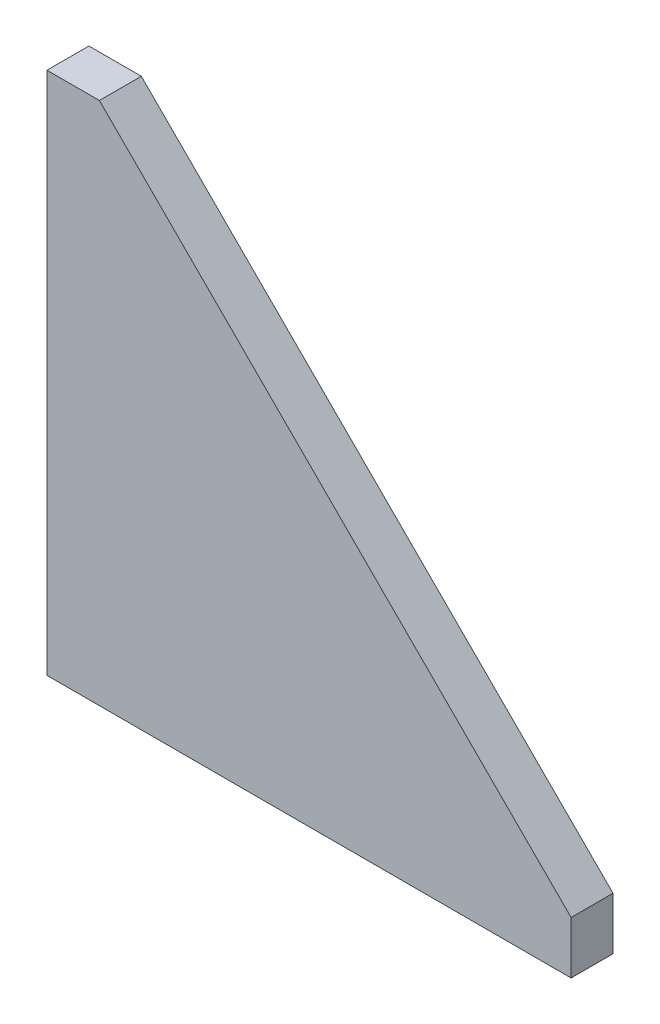
ISO-10303-21;
HEADER;
FILE_DESCRIPTION(('STEP AP214'),'2;1');
FILE_NAME('part.step','',(''),(''),'','','');
FILE_SCHEMA(('AUTOMOTIVE_DESIGN { 1 0 10303 214 1 1 1 1 }'));
ENDSEC;
DATA;
#1=APPLICATION_CONTEXT('core data for automotive mechanical design processes');
#2=APPLICATION_PROTOCOL_DEFINITION('international standard','automotive_design',2000,#1);
#3=PRODUCT_CONTEXT('',#1,'mechanical');
#4=PRODUCT('Part','Part','',(#3));
#5=PRODUCT_RELATED_PRODUCT_CATEGORY('part','',(#4));
#6=PRODUCT_DEFINITION_FORMATION('','',#4);
#7=PRODUCT_DEFINITION_CONTEXT('part definition',#1,'design');
#8=PRODUCT_DEFINITION('design','',#6,#7);
#9=PRODUCT_DEFINITION_SHAPE('','',#8);
#10=(LENGTH_UNIT() NAMED_UNIT(*) SI_UNIT(.MILLI.,.METRE.));
#11=(NAMED_UNIT(*) PLANE_ANGLE_UNIT() SI_UNIT($,.RADIAN.));
#12=(NAMED_UNIT(*) SI_UNIT($,.STERADIAN.) SOLID_ANGLE_UNIT());
#13=UNCERTAINTY_MEASURE_WITH_UNIT(LENGTH_MEASURE(1.E-05),#10,'distance_accuracy_value','');
#14=(GEOMETRIC_REPRESENTATION_CONTEXT(3) GLOBAL_UNCERTAINTY_ASSIGNED_CONTEXT((#13)) GLOBAL_UNIT_ASSIGNED_CONTEXT((#10,
#11,#12)) REPRESENTATION_CONTEXT('',''));
#15=CARTESIAN_POINT('',(0.,0.,0.));
#16=DIRECTION('',(0.,0.,1.));
#17=DIRECTION('',(1.,0.,0.));
#18=AXIS2_PLACEMENT_3D('',#15,#16,#17);
#19=CARTESIAN_POINT('',(0.,150.,12.));
#20=DIRECTION('',(1.,0.,0.));
#21=DIRECTION('',(0.,0.,-1.));
#22=AXIS2_PLACEMENT_3D('',#19,#20,#21);
#23=PLANE('',#22);
#24=CARTESIAN_POINT('',(0.,50.,6.));
#25=DIRECTION('',(1.,0.,0.));
#26=DIRECTION('',(0.,0.,-1.));
#27=AXIS2_PLACEMENT_3D('',#24,#25,#26);
#28=CIRCLE('',#27,2.5);
#29=CARTESIAN_POINT('',(0.,50.,3.5));
#30=VERTEX_POINT('',#29);
#31=EDGE_CURVE('E153',#30,#30,#28,.T.);
#32=ORIENTED_EDGE('',*,*,#31,.T.);
#33=EDGE_LOOP('',(#32));
#34=FACE_BOUND('',#33,.T.);
#35=CARTESIAN_POINT('',(0.,120.,6.));
#36=DIRECTION('',(1.,0.,0.));
#37=DIRECTION('',(0.,0.,-1.));
#38=AXIS2_PLACEMENT_3D('',#35,#36,#37);
#39=CIRCLE('',#38,2.5);
#40=CARTESIAN_POINT('',(0.,120.,3.5));
#41=VERTEX_POINT('',#40);
#42=EDGE_CURVE('E156',#41,#41,#39,.T.);
#43=ORIENTED_EDGE('',*,*,#42,.T.);
#44=EDGE_LOOP('',(#43));
#45=FACE_BOUND('',#44,.T.);
#46=DIRECTION('',(0.,-1.,0.));
#47=VECTOR('',#46,1.);
#48=CARTESIAN_POINT('',(0.,150.,0.));
#49=LINE('',#48,#47);
#50=CARTESIAN_POINT('',(0.,150.,0.));
#51=VERTEX_POINT('',#50);
#52=CARTESIAN_POINT('',(0.,0.,0.));
#53=VERTEX_POINT('',#52);
#54=EDGE_CURVE('E114',#51,#53,#49,.T.);
#55=ORIENTED_EDGE('',*,*,#54,.T.);
#56=DIRECTION('',(0.,0.,-1.));
#57=VECTOR('',#56,1.);
#58=CARTESIAN_POINT('',(0.,0.,12.));
#59=LINE('',#58,#57);
#60=CARTESIAN_POINT('',(0.,0.,12.));
#61=VERTEX_POINT('',#60);
#62=EDGE_CURVE('E11',#61,#53,#59,.T.);
#63=ORIENTED_EDGE('',*,*,#62,.F.);
#64=DIRECTION('',(0.,-1.,0.));
#65=VECTOR('',#64,1.);
#66=CARTESIAN_POINT('',(0.,150.,12.));
#67=LINE('',#66,#65);
#68=CARTESIAN_POINT('',(0.,150.,12.));
#69=VERTEX_POINT('',#68);
#70=EDGE_CURVE('E123',#69,#61,#67,.T.);
#71=ORIENTED_EDGE('',*,*,#70,.F.);
#72=DIRECTION('',(0.,0.,-1.));
#73=VECTOR('',#72,1.);
#74=CARTESIAN_POINT('',(0.,150.,12.));
#75=LINE('',#74,#73);
#76=EDGE_CURVE('E110',#69,#51,#75,.T.);
#77=ORIENTED_EDGE('',*,*,#76,.T.);
#78=EDGE_LOOP('',(#55,#63,#71,#77));
#79=FACE_BOUND('',#78,.T.);
#80=ADVANCED_FACE('F40',(#34,#45,#79),#23,.F.);
#81=CARTESIAN_POINT('',(0.,0.,12.));
#82=DIRECTION('',(0.,1.,0.));
#83=DIRECTION('',(0.,0.,1.));
#84=AXIS2_PLACEMENT_3D('',#81,#82,#83);
#85=PLANE('',#84);
#86=CARTESIAN_POINT('',(33.,0.,6.));
#87=DIRECTION('',(0.,1.,0.));
#88=DIRECTION('',(0.,0.,1.));
#89=AXIS2_PLACEMENT_3D('',#86,#87,#88);
#90=CIRCLE('',#89,2.5);
#91=CARTESIAN_POINT('',(33.,0.,8.5));
#92=VERTEX_POINT('',#91);
#93=EDGE_CURVE('E168',#92,#92,#90,.T.);
#94=ORIENTED_EDGE('',*,*,#93,.T.);
#95=EDGE_LOOP('',(#94));
#96=FACE_BOUND('',#95,.T.);
#97=CARTESIAN_POINT('',(113.,0.,6.));
#98=DIRECTION('',(0.,1.,0.));
#99=DIRECTION('',(0.,0.,1.));
#100=AXIS2_PLACEMENT_3D('',#97,#98,#99);
#101=CIRCLE('',#100,2.5);
#102=CARTESIAN_POINT('',(113.,0.,8.5));
#103=VERTEX_POINT('',#102);
#104=EDGE_CURVE('E171',#103,#103,#101,.T.);
#105=ORIENTED_EDGE('',*,*,#104,.T.);
#106=EDGE_LOOP('',(#105));
#107=FACE_BOUND('',#106,.T.);
#108=DIRECTION('',(1.,0.,0.));
#109=VECTOR('',#108,1.);
#110=CARTESIAN_POINT('',(0.,0.,0.));
#111=LINE('',#110,#109);
#112=CARTESIAN_POINT('',(150.,0.,0.));
#113=VERTEX_POINT('',#112);
#114=EDGE_CURVE('E117',#53,#113,#111,.T.);
#115=ORIENTED_EDGE('',*,*,#114,.T.);
#116=DIRECTION('',(0.,0.,-1.));
#117=VECTOR('',#116,1.);
#118=CARTESIAN_POINT('',(150.,0.,12.));
#119=LINE('',#118,#117);
#120=CARTESIAN_POINT('',(150.,0.,12.));
#121=VERTEX_POINT('',#120);
#122=EDGE_CURVE('E48',#121,#113,#119,.T.);
#123=ORIENTED_EDGE('',*,*,#122,.F.);
#124=DIRECTION('',(1.,0.,0.));
#125=VECTOR('',#124,1.);
#126=CARTESIAN_POINT('',(0.,0.,12.));
#127=LINE('',#126,#125);
#128=EDGE_CURVE('E90',#61,#121,#127,.T.);
#129=ORIENTED_EDGE('',*,*,#128,.F.);
#130=ORIENTED_EDGE('',*,*,#62,.T.);
#131=EDGE_LOOP('',(#115,#123,#129,#130));
#132=FACE_BOUND('',#131,.T.);
#133=ADVANCED_FACE('F142',(#96,#107,#132),#85,.F.);
#134=CARTESIAN_POINT('',(150.,0.,12.));
#135=DIRECTION('',(-1.,0.,0.));
#136=DIRECTION('',(0.,0.,1.));
#137=AXIS2_PLACEMENT_3D('',#134,#135,#136);
#138=PLANE('',#137);
#139=DIRECTION('',(0.,1.,0.));
#140=VECTOR('',#139,1.);
#141=CARTESIAN_POINT('',(150.,0.,0.));
#142=LINE('',#141,#140);
#143=CARTESIAN_POINT('',(150.,15.,0.));
#144=VERTEX_POINT('',#143);
#145=EDGE_CURVE('E105',#113,#144,#142,.T.);
#146=ORIENTED_EDGE('',*,*,#145,.T.);
#147=DIRECTION('',(0.,0.,-1.));
#148=VECTOR('',#147,1.);
#149=CARTESIAN_POINT('',(150.,15.,12.));
#150=LINE('',#149,#148);
#151=CARTESIAN_POINT('',(150.,15.,12.));
#152=VERTEX_POINT('',#151);
#153=EDGE_CURVE('E102',#152,#144,#150,.T.);
#154=ORIENTED_EDGE('',*,*,#153,.F.);
#155=DIRECTION('',(0.,1.,0.));
#156=VECTOR('',#155,1.);
#157=CARTESIAN_POINT('',(150.,0.,12.));
#158=LINE('',#157,#156);
#159=EDGE_CURVE('E94',#121,#152,#158,.T.);
#160=ORIENTED_EDGE('',*,*,#159,.F.);
#161=ORIENTED_EDGE('',*,*,#122,.T.);
#162=EDGE_LOOP('',(#146,#154,#160,#161));
#163=FACE_BOUND('',#162,.T.);
#164=ADVANCED_FACE('F103',(#163),#138,.F.);
#165=CARTESIAN_POINT('',(150.,15.,12.));
#166=DIRECTION('',(-0.707106781186547,-0.707106781186547,0.));
#167=DIRECTION('',(0.707106781186548,-0.707106781186548,0.));
#168=AXIS2_PLACEMENT_3D('',#165,#166,#167);
#169=PLANE('',#168);
#170=DIRECTION('',(-0.707106781186548,0.707106781186548,0.));
#171=VECTOR('',#170,1.);
#172=CARTESIAN_POINT('',(150.,15.,0.));
#173=LINE('',#172,#171);
#174=CARTESIAN_POINT('',(15.,150.,0.));
#175=VERTEX_POINT('',#174);
#176=EDGE_CURVE('E76',#144,#175,#173,.T.);
#177=ORIENTED_EDGE('',*,*,#176,.T.);
#178=DIRECTION('',(0.,0.,-1.));
#179=VECTOR('',#178,1.);
#180=CARTESIAN_POINT('',(15.,150.,12.));
#181=LINE('',#180,#179);
#182=CARTESIAN_POINT('',(15.,150.,12.));
#183=VERTEX_POINT('',#182);
#184=EDGE_CURVE('E106',#183,#175,#181,.T.);
#185=ORIENTED_EDGE('',*,*,#184,.F.);
#186=DIRECTION('',(-0.707106781186548,0.707106781186548,0.));
#187=VECTOR('',#186,1.);
#188=CARTESIAN_POINT('',(150.,15.,12.));
#189=LINE('',#188,#187);
#190=EDGE_CURVE('E98',#152,#183,#189,.T.);
#191=ORIENTED_EDGE('',*,*,#190,.F.);
#192=ORIENTED_EDGE('',*,*,#153,.T.);
#193=EDGE_LOOP('',(#177,#185,#191,#192));
#194=FACE_BOUND('',#193,.T.);
#195=ADVANCED_FACE('F108',(#194),#169,.F.);
#196=CARTESIAN_POINT('',(15.,150.,12.));
#197=DIRECTION('',(0.,-1.,0.));
#198=DIRECTION('',(0.,0.,-1.));
#199=AXIS2_PLACEMENT_3D('',#196,#197,#198);
#200=PLANE('',#199);
#201=DIRECTION('',(-1.,0.,0.));
#202=VECTOR('',#201,1.);
#203=CARTESIAN_POINT('',(15.,150.,0.));
#204=LINE('',#203,#202);
#205=EDGE_CURVE('E82',#175,#51,#204,.T.);
#206=ORIENTED_EDGE('',*,*,#205,.T.);
#207=ORIENTED_EDGE('',*,*,#76,.F.);
#208=DIRECTION('',(-1.,0.,0.));
#209=VECTOR('',#208,1.);
#210=CARTESIAN_POINT('',(15.,150.,12.));
#211=LINE('',#210,#209);
#212=EDGE_CURVE('E56',#183,#69,#211,.T.);
#213=ORIENTED_EDGE('',*,*,#212,.F.);
#214=ORIENTED_EDGE('',*,*,#184,.T.);
#215=EDGE_LOOP('',(#206,#207,#213,#214));
#216=FACE_BOUND('',#215,.T.);
#217=ADVANCED_FACE('F131',(#216),#200,.F.);
#218=CARTESIAN_POINT('',(0.,0.,12.));
#219=DIRECTION('',(0.,0.,1.));
#220=DIRECTION('',(1.,0.,0.));
#221=AXIS2_PLACEMENT_3D('',#218,#219,#220);
#222=PLANE('',#221);
#223=ORIENTED_EDGE('',*,*,#70,.T.);
#224=ORIENTED_EDGE('',*,*,#128,.T.);
#225=ORIENTED_EDGE('',*,*,#159,.T.);
#226=ORIENTED_EDGE('',*,*,#190,.T.);
#227=ORIENTED_EDGE('',*,*,#212,.T.);
#228=EDGE_LOOP('',(#223,#224,#225,#226,#227));
#229=FACE_BOUND('',#228,.T.);
#230=ADVANCED_FACE('F96',(#229),#222,.T.);
#231=CARTESIAN_POINT('',(0.,0.,0.));
#232=DIRECTION('',(0.,0.,1.));
#233=DIRECTION('',(1.,0.,0.));
#234=AXIS2_PLACEMENT_3D('',#231,#232,#233);
#235=PLANE('',#234);
#236=ORIENTED_EDGE('',*,*,#54,.F.);
#237=ORIENTED_EDGE('',*,*,#205,.F.);
#238=ORIENTED_EDGE('',*,*,#176,.F.);
#239=ORIENTED_EDGE('',*,*,#145,.F.);
#240=ORIENTED_EDGE('',*,*,#114,.F.);
#241=EDGE_LOOP('',(#236,#237,#238,#239,#240));
#242=FACE_BOUND('',#241,.T.);
#243=ADVANCED_FACE('F127',(#242),#235,.F.);
#244=CARTESIAN_POINT('',(113.,15.,6.));
#245=DIRECTION('',(0.,-1.,0.));
#246=DIRECTION('',(0.,0.,-1.));
#247=AXIS2_PLACEMENT_3D('',#244,#245,#246);
#248=CYLINDRICAL_SURFACE('',#247,2.5);
#249=CARTESIAN_POINT('',(113.,15.,6.));
#250=DIRECTION('',(0.,1.,0.));
#251=DIRECTION('',(0.,0.,1.));
#252=AXIS2_PLACEMENT_3D('',#249,#250,#251);
#253=CIRCLE('',#252,2.5);
#254=CARTESIAN_POINT('',(113.,15.,8.5));
#255=VERTEX_POINT('',#254);
#256=EDGE_CURVE('E174',#255,#255,#253,.T.);
#257=ORIENTED_EDGE('',*,*,#256,.T.);
#258=EDGE_LOOP('',(#257));
#259=FACE_BOUND('',#258,.T.);
#260=ORIENTED_EDGE('',*,*,#104,.F.);
#261=EDGE_LOOP('',(#260));
#262=FACE_BOUND('',#261,.T.);
#263=ADVANCED_FACE('F208',(#259,#262),#248,.F.);
#264=CARTESIAN_POINT('',(113.,15.,6.));
#265=DIRECTION('',(0.,1.,0.));
#266=DIRECTION('',(0.,0.,1.));
#267=AXIS2_PLACEMENT_3D('',#264,#265,#266);
#268=PLANE('',#267);
#269=ORIENTED_EDGE('',*,*,#256,.F.);
#270=EDGE_LOOP('',(#269));
#271=FACE_BOUND('',#270,.T.);
#272=ADVANCED_FACE('F206',(#271),#268,.F.);
#273=CARTESIAN_POINT('',(33.,15.,6.));
#274=DIRECTION('',(0.,-1.,0.));
#275=DIRECTION('',(0.,0.,-1.));
#276=AXIS2_PLACEMENT_3D('',#273,#274,#275);
#277=CYLINDRICAL_SURFACE('',#276,2.5);
#278=CARTESIAN_POINT('',(33.,15.,6.));
#279=DIRECTION('',(0.,1.,0.));
#280=DIRECTION('',(0.,0.,1.));
#281=AXIS2_PLACEMENT_3D('',#278,#279,#280);
#282=CIRCLE('',#281,2.5);
#283=CARTESIAN_POINT('',(33.,15.,8.5));
#284=VERTEX_POINT('',#283);
#285=EDGE_CURVE('E118',#284,#284,#282,.T.);
#286=ORIENTED_EDGE('',*,*,#285,.T.);
#287=EDGE_LOOP('',(#286));
#288=FACE_BOUND('',#287,.T.);
#289=ORIENTED_EDGE('',*,*,#93,.F.);
#290=EDGE_LOOP('',(#289));
#291=FACE_BOUND('',#290,.T.);
#292=ADVANCED_FACE('F202',(#288,#291),#277,.F.);
#293=CARTESIAN_POINT('',(33.,15.,6.));
#294=DIRECTION('',(0.,1.,0.));
#295=DIRECTION('',(0.,0.,1.));
#296=AXIS2_PLACEMENT_3D('',#293,#294,#295);
#297=PLANE('',#296);
#298=ORIENTED_EDGE('',*,*,#285,.F.);
#299=EDGE_LOOP('',(#298));
#300=FACE_BOUND('',#299,.T.);
#301=ADVANCED_FACE('F196',(#300),#297,.F.);
#302=CARTESIAN_POINT('',(15.,120.,6.));
#303=DIRECTION('',(-1.,0.,0.));
#304=DIRECTION('',(0.,0.,1.));
#305=AXIS2_PLACEMENT_3D('',#302,#303,#304);
#306=CYLINDRICAL_SURFACE('',#305,2.5);
#307=CARTESIAN_POINT('',(15.,120.,6.));
#308=DIRECTION('',(1.,0.,0.));
#309=DIRECTION('',(0.,0.,-1.));
#310=AXIS2_PLACEMENT_3D('',#307,#308,#309);
#311=CIRCLE('',#310,2.5);
#312=CARTESIAN_POINT('',(15.,120.,3.5));
#313=VERTEX_POINT('',#312);
#314=EDGE_CURVE('E158',#313,#313,#311,.T.);
#315=ORIENTED_EDGE('',*,*,#314,.T.);
#316=EDGE_LOOP('',(#315));
#317=FACE_BOUND('',#316,.T.);
#318=ORIENTED_EDGE('',*,*,#42,.F.);
#319=EDGE_LOOP('',(#318));
#320=FACE_BOUND('',#319,.T.);
#321=ADVANCED_FACE('F194',(#317,#320),#306,.F.);
#322=CARTESIAN_POINT('',(15.,120.,6.));
#323=DIRECTION('',(1.,0.,0.));
#324=DIRECTION('',(0.,0.,-1.));
#325=AXIS2_PLACEMENT_3D('',#322,#323,#324);
#326=PLANE('',#325);
#327=ORIENTED_EDGE('',*,*,#314,.F.);
#328=EDGE_LOOP('',(#327));
#329=FACE_BOUND('',#328,.T.);
#330=ADVANCED_FACE('F191',(#329),#326,.F.);
#331=CARTESIAN_POINT('',(15.,50.,6.));
#332=DIRECTION('',(-1.,0.,0.));
#333=DIRECTION('',(0.,0.,1.));
#334=AXIS2_PLACEMENT_3D('',#331,#332,#333);
#335=CYLINDRICAL_SURFACE('',#334,2.5);
#336=CARTESIAN_POINT('',(15.,50.,6.));
#337=DIRECTION('',(1.,0.,0.));
#338=DIRECTION('',(0.,0.,-1.));
#339=AXIS2_PLACEMENT_3D('',#336,#337,#338);
#340=CIRCLE('',#339,2.5);
#341=CARTESIAN_POINT('',(15.,50.,3.5));
#342=VERTEX_POINT('',#341);
#343=EDGE_CURVE('E160',#342,#342,#340,.T.);
#344=ORIENTED_EDGE('',*,*,#343,.T.);
#345=EDGE_LOOP('',(#344));
#346=FACE_BOUND('',#345,.T.);
#347=ORIENTED_EDGE('',*,*,#31,.F.);
#348=EDGE_LOOP('',(#347));
#349=FACE_BOUND('',#348,.T.);
#350=ADVANCED_FACE('F182',(#346,#349),#335,.F.);
#351=CARTESIAN_POINT('',(15.,50.,6.));
#352=DIRECTION('',(1.,0.,0.));
#353=DIRECTION('',(0.,0.,-1.));
#354=AXIS2_PLACEMENT_3D('',#351,#352,#353);
#355=PLANE('',#354);
#356=ORIENTED_EDGE('',*,*,#343,.F.);
#357=EDGE_LOOP('',(#356));
#358=FACE_BOUND('',#357,.T.);
#359=ADVANCED_FACE('F185',(#358),#355,.F.);
#360=CLOSED_SHELL('',(#80,#133,#164,#195,#217,#230,#243,#263,#272,#292,#301,#321,#330,#350,#359));
#361=MANIFOLD_SOLID_BREP('B2',#360);
#362=ADVANCED_BREP_SHAPE_REPRESENTATION('',(#18,#361),#14);
#363=SHAPE_DEFINITION_REPRESENTATION(#9,#362);
ENDSEC;
END-ISO-10303-21;
